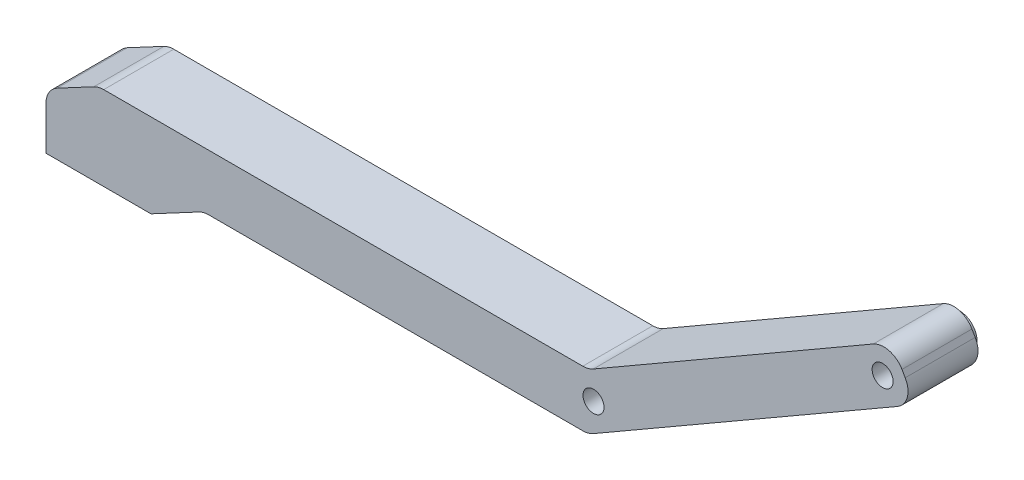
ISO-10303-21;
HEADER;
FILE_DESCRIPTION(('STEP AP214'),'2;1');
FILE_NAME('part.step','',(''),(''),'','','');
FILE_SCHEMA(('AUTOMOTIVE_DESIGN { 1 0 10303 214 1 1 1 1 }'));
ENDSEC;
DATA;
#1=APPLICATION_CONTEXT('core data for automotive mechanical design processes');
#2=APPLICATION_PROTOCOL_DEFINITION('international standard','automotive_design',2000,#1);
#3=PRODUCT_CONTEXT('',#1,'mechanical');
#4=PRODUCT('Part','Part','',(#3));
#5=PRODUCT_RELATED_PRODUCT_CATEGORY('part','',(#4));
#6=PRODUCT_DEFINITION_FORMATION('','',#4);
#7=PRODUCT_DEFINITION_CONTEXT('part definition',#1,'design');
#8=PRODUCT_DEFINITION('design','',#6,#7);
#9=PRODUCT_DEFINITION_SHAPE('','',#8);
#10=(LENGTH_UNIT() NAMED_UNIT(*) SI_UNIT(.MILLI.,.METRE.));
#11=(NAMED_UNIT(*) PLANE_ANGLE_UNIT() SI_UNIT($,.RADIAN.));
#12=(NAMED_UNIT(*) SI_UNIT($,.STERADIAN.) SOLID_ANGLE_UNIT());
#13=UNCERTAINTY_MEASURE_WITH_UNIT(LENGTH_MEASURE(1.E-05),#10,'distance_accuracy_value','');
#14=(GEOMETRIC_REPRESENTATION_CONTEXT(3) GLOBAL_UNCERTAINTY_ASSIGNED_CONTEXT((#13)) GLOBAL_UNIT_ASSIGNED_CONTEXT((#10,
#11,#12)) REPRESENTATION_CONTEXT('',''));
#15=CARTESIAN_POINT('',(0.,0.,0.));
#16=DIRECTION('',(0.,0.,1.));
#17=DIRECTION('',(1.,0.,0.));
#18=AXIS2_PLACEMENT_3D('',#15,#16,#17);
#19=CARTESIAN_POINT('',(0.,0.,10.));
#20=DIRECTION('',(0.,0.,1.));
#21=DIRECTION('',(1.,0.,0.));
#22=AXIS2_PLACEMENT_3D('',#19,#20,#21);
#23=PLANE('',#22);
#24=DIRECTION('',(-0.500000000000005,0.866025403784436,0.));
#25=VECTOR('',#24,1.);
#26=CARTESIAN_POINT('',(116.76537180436,27.,10.));
#27=LINE('',#26,#25);
#28=CARTESIAN_POINT('',(115.26537180436,29.5980762113533,10.));
#29=VERTEX_POINT('',#28);
#30=CARTESIAN_POINT('',(114.801270189222,30.4019237886467,10.));
#31=VERTEX_POINT('',#30);
#32=EDGE_CURVE('E335',#29,#31,#27,.T.);
#33=ORIENTED_EDGE('',*,*,#32,.T.);
#34=CARTESIAN_POINT('',(112.203193977869,28.9019237886467,10.));
#35=DIRECTION('',(0.,0.,1.));
#36=DIRECTION('',(1.,0.,0.));
#37=AXIS2_PLACEMENT_3D('',#34,#35,#36);
#38=CIRCLE('',#37,3.);
#39=CARTESIAN_POINT('',(110.703193977869,31.5,10.));
#40=VERTEX_POINT('',#39);
#41=EDGE_CURVE('E275',#31,#40,#38,.T.);
#42=ORIENTED_EDGE('',*,*,#41,.T.);
#43=DIRECTION('',(-0.866025403784439,-0.5,0.));
#44=VECTOR('',#43,1.);
#45=CARTESIAN_POINT('',(70.,8.,10.));
#46=LINE('',#45,#44);
#47=CARTESIAN_POINT('',(70.6961524227066,8.40192378864668,10.));
#48=VERTEX_POINT('',#47);
#49=EDGE_CURVE('E327',#40,#48,#46,.T.);
#50=ORIENTED_EDGE('',*,*,#49,.T.);
#51=CARTESIAN_POINT('',(69.1961524227066,11.,10.));
#52=DIRECTION('',(0.,0.,1.));
#53=DIRECTION('',(1.,0.,0.));
#54=AXIS2_PLACEMENT_3D('',#51,#52,#53);
#55=CIRCLE('',#54,3.);
#56=CARTESIAN_POINT('',(69.1961524227066,8.,10.));
#57=VERTEX_POINT('',#56);
#58=EDGE_CURVE('E11',#48,#57,#55,.F.);
#59=ORIENTED_EDGE('',*,*,#58,.T.);
#60=DIRECTION('',(-1.,0.,0.));
#61=VECTOR('',#60,1.);
#62=CARTESIAN_POINT('',(0.,8.,10.));
#63=LINE('',#62,#61);
#64=CARTESIAN_POINT('',(0.749999999999999,8.,10.));
#65=VERTEX_POINT('',#64);
#66=EDGE_CURVE('E325',#57,#65,#63,.T.);
#67=ORIENTED_EDGE('',*,*,#66,.T.);
#68=CARTESIAN_POINT('',(0.749999999999999,5.,10.));
#69=DIRECTION('',(0.,0.,1.));
#70=DIRECTION('',(1.,0.,0.));
#71=AXIS2_PLACEMENT_3D('',#68,#69,#70);
#72=CIRCLE('',#71,3.);
#73=CARTESIAN_POINT('',(-0.661764705882355,7.64705882352941,10.));
#74=VERTEX_POINT('',#73);
#75=EDGE_CURVE('E266',#65,#74,#72,.T.);
#76=ORIENTED_EDGE('',*,*,#75,.T.);
#77=DIRECTION('',(-0.882352941176471,-0.470588235294118,0.));
#78=VECTOR('',#77,1.);
#79=CARTESIAN_POINT('',(0.,8.,10.));
#80=LINE('',#79,#78);
#81=CARTESIAN_POINT('',(-5.91176470588236,4.84705882352941,10.));
#82=VERTEX_POINT('',#81);
#83=EDGE_CURVE('E170',#74,#82,#80,.T.);
#84=ORIENTED_EDGE('',*,*,#83,.T.);
#85=CARTESIAN_POINT('',(-4.5,2.2,10.));
#86=DIRECTION('',(0.,0.,1.));
#87=DIRECTION('',(1.,0.,0.));
#88=AXIS2_PLACEMENT_3D('',#85,#86,#87);
#89=CIRCLE('',#88,3.);
#90=CARTESIAN_POINT('',(-7.5,2.2,10.));
#91=VERTEX_POINT('',#90);
#92=EDGE_CURVE('E62',#82,#91,#89,.T.);
#93=ORIENTED_EDGE('',*,*,#92,.T.);
#94=DIRECTION('',(0.,-1.,0.));
#95=VECTOR('',#94,1.);
#96=CARTESIAN_POINT('',(-7.5,4.,10.));
#97=LINE('',#96,#95);
#98=CARTESIAN_POINT('',(-7.5,-4.,10.));
#99=VERTEX_POINT('',#98);
#100=EDGE_CURVE('E158',#91,#99,#97,.T.);
#101=ORIENTED_EDGE('',*,*,#100,.T.);
#102=DIRECTION('',(1.,0.,0.));
#103=VECTOR('',#102,1.);
#104=CARTESIAN_POINT('',(-7.5,-4.,10.));
#105=LINE('',#104,#103);
#106=CARTESIAN_POINT('',(7.5,-4.,10.));
#107=VERTEX_POINT('',#106);
#108=EDGE_CURVE('E164',#99,#107,#105,.T.);
#109=ORIENTED_EDGE('',*,*,#108,.T.);
#110=DIRECTION('',(0.882352941176471,0.470588235294118,0.));
#111=VECTOR('',#110,1.);
#112=CARTESIAN_POINT('',(7.5,-4.,10.));
#113=LINE('',#112,#111);
#114=CARTESIAN_POINT('',(14.3382352941176,-0.352941176470585,10.));
#115=VERTEX_POINT('',#114);
#116=EDGE_CURVE('E224',#107,#115,#113,.T.);
#117=ORIENTED_EDGE('',*,*,#116,.T.);
#118=CARTESIAN_POINT('',(15.75,-3.,10.));
#119=DIRECTION('',(0.,0.,1.));
#120=DIRECTION('',(1.,0.,0.));
#121=AXIS2_PLACEMENT_3D('',#118,#119,#120);
#122=CIRCLE('',#121,3.);
#123=CARTESIAN_POINT('',(15.75,0.,10.));
#124=VERTEX_POINT('',#123);
#125=EDGE_CURVE('E304',#115,#124,#122,.F.);
#126=ORIENTED_EDGE('',*,*,#125,.T.);
#127=DIRECTION('',(1.,0.,0.));
#128=VECTOR('',#127,1.);
#129=CARTESIAN_POINT('',(15.,0.,10.));
#130=LINE('',#129,#128);
#131=CARTESIAN_POINT('',(69.1961524227066,0.,10.));
#132=VERTEX_POINT('',#131);
#133=EDGE_CURVE('E344',#124,#132,#130,.T.);
#134=ORIENTED_EDGE('',*,*,#133,.T.);
#135=CARTESIAN_POINT('',(69.1961524227066,3.,10.));
#136=DIRECTION('',(0.,0.,1.));
#137=DIRECTION('',(1.,0.,0.));
#138=AXIS2_PLACEMENT_3D('',#135,#136,#137);
#139=CIRCLE('',#138,3.);
#140=CARTESIAN_POINT('',(70.6961524227066,0.40192378864668,10.));
#141=VERTEX_POINT('',#140);
#142=EDGE_CURVE('E269',#132,#141,#139,.T.);
#143=ORIENTED_EDGE('',*,*,#142,.T.);
#144=DIRECTION('',(0.866025403784439,0.5,0.));
#145=VECTOR('',#144,1.);
#146=CARTESIAN_POINT('',(70.,0.,10.));
#147=LINE('',#146,#145);
#148=CARTESIAN_POINT('',(114.167295593006,25.5,10.));
#149=VERTEX_POINT('',#148);
#150=EDGE_CURVE('E340',#141,#149,#147,.T.);
#151=ORIENTED_EDGE('',*,*,#150,.T.);
#152=CARTESIAN_POINT('',(112.667295593006,28.0980762113533,10.));
#153=DIRECTION('',(0.,0.,1.));
#154=DIRECTION('',(1.,0.,0.));
#155=AXIS2_PLACEMENT_3D('',#152,#153,#154);
#156=CIRCLE('',#155,3.);
#157=EDGE_CURVE('E272',#149,#29,#156,.T.);
#158=ORIENTED_EDGE('',*,*,#157,.T.);
#159=EDGE_LOOP('',(#33,#42,#50,#59,#67,#76,#84,#93,#101,#109,#117,#126,#134,#143,#151,#158));
#160=FACE_BOUND('',#159,.T.);
#161=CARTESIAN_POINT('',(70.727461339179,4.42000000000001,10.));
#162=DIRECTION('',(0.,0.,1.));
#163=DIRECTION('',(1.,0.,0.));
#164=AXIS2_PLACEMENT_3D('',#161,#162,#163);
#165=CIRCLE('',#164,1.5);
#166=CARTESIAN_POINT('',(72.227461339179,4.42000000000001,10.));
#167=VERTEX_POINT('',#166);
#168=EDGE_CURVE('E353',#167,#167,#165,.T.);
#169=ORIENTED_EDGE('',*,*,#168,.F.);
#170=EDGE_LOOP('',(#169));
#171=FACE_BOUND('',#170,.T.);
#172=CARTESIAN_POINT('',(112.036873099697,28.27,10.));
#173=DIRECTION('',(0.,0.,1.));
#174=DIRECTION('',(1.,0.,0.));
#175=AXIS2_PLACEMENT_3D('',#172,#173,#174);
#176=CIRCLE('',#175,1.5);
#177=CARTESIAN_POINT('',(113.536873099697,28.27,10.));
#178=VERTEX_POINT('',#177);
#179=EDGE_CURVE('E197',#178,#178,#176,.T.);
#180=ORIENTED_EDGE('',*,*,#179,.F.);
#181=EDGE_LOOP('',(#180));
#182=FACE_BOUND('',#181,.T.);
#183=ADVANCED_FACE('F45',(#160,#171,#182),#23,.T.);
#184=CARTESIAN_POINT('',(0.,0.,0.));
#185=DIRECTION('',(0.,0.,1.));
#186=DIRECTION('',(1.,0.,0.));
#187=AXIS2_PLACEMENT_3D('',#184,#185,#186);
#188=PLANE('',#187);
#189=CARTESIAN_POINT('',(112.036873099697,28.27,0.));
#190=DIRECTION('',(0.,0.,1.));
#191=DIRECTION('',(1.,0.,0.));
#192=AXIS2_PLACEMENT_3D('',#189,#190,#191);
#193=CIRCLE('',#192,2.5);
#194=CARTESIAN_POINT('',(114.536873099697,28.27,0.));
#195=VERTEX_POINT('',#194);
#196=EDGE_CURVE('E49',#195,#195,#193,.T.);
#197=ORIENTED_EDGE('',*,*,#196,.T.);
#198=EDGE_LOOP('',(#197));
#199=FACE_BOUND('',#198,.T.);
#200=DIRECTION('',(-0.866025403784439,-0.5,0.));
#201=VECTOR('',#200,1.);
#202=CARTESIAN_POINT('',(70.,8.,0.));
#203=LINE('',#202,#201);
#204=CARTESIAN_POINT('',(110.703193977869,31.5,0.));
#205=VERTEX_POINT('',#204);
#206=CARTESIAN_POINT('',(70.6961524227066,8.40192378864668,0.));
#207=VERTEX_POINT('',#206);
#208=EDGE_CURVE('E209',#205,#207,#203,.T.);
#209=ORIENTED_EDGE('',*,*,#208,.F.);
#210=CARTESIAN_POINT('',(112.203193977869,28.9019237886467,0.));
#211=DIRECTION('',(0.,0.,1.));
#212=DIRECTION('',(1.,0.,0.));
#213=AXIS2_PLACEMENT_3D('',#210,#211,#212);
#214=CIRCLE('',#213,3.);
#215=CARTESIAN_POINT('',(114.801270189222,30.4019237886467,0.));
#216=VERTEX_POINT('',#215);
#217=EDGE_CURVE('E254',#205,#216,#214,.F.);
#218=ORIENTED_EDGE('',*,*,#217,.T.);
#219=DIRECTION('',(-0.500000000000005,0.866025403784436,0.));
#220=VECTOR('',#219,1.);
#221=CARTESIAN_POINT('',(116.76537180436,27.,0.));
#222=LINE('',#221,#220);
#223=CARTESIAN_POINT('',(115.26537180436,29.5980762113533,0.));
#224=VERTEX_POINT('',#223);
#225=EDGE_CURVE('E205',#224,#216,#222,.T.);
#226=ORIENTED_EDGE('',*,*,#225,.F.);
#227=CARTESIAN_POINT('',(112.667295593006,28.0980762113533,0.));
#228=DIRECTION('',(0.,0.,1.));
#229=DIRECTION('',(1.,0.,0.));
#230=AXIS2_PLACEMENT_3D('',#227,#228,#229);
#231=CIRCLE('',#230,3.);
#232=CARTESIAN_POINT('',(114.167295593006,25.5,0.));
#233=VERTEX_POINT('',#232);
#234=EDGE_CURVE('E251',#224,#233,#231,.F.);
#235=ORIENTED_EDGE('',*,*,#234,.T.);
#236=DIRECTION('',(0.866025403784439,0.5,0.));
#237=VECTOR('',#236,1.);
#238=CARTESIAN_POINT('',(70.,0.,0.));
#239=LINE('',#238,#237);
#240=CARTESIAN_POINT('',(70.6961524227066,0.40192378864668,0.));
#241=VERTEX_POINT('',#240);
#242=EDGE_CURVE('E201',#241,#233,#239,.T.);
#243=ORIENTED_EDGE('',*,*,#242,.F.);
#244=CARTESIAN_POINT('',(69.1961524227066,3.,0.));
#245=DIRECTION('',(0.,0.,1.));
#246=DIRECTION('',(1.,0.,0.));
#247=AXIS2_PLACEMENT_3D('',#244,#245,#246);
#248=CIRCLE('',#247,3.);
#249=CARTESIAN_POINT('',(69.1961524227066,0.,0.));
#250=VERTEX_POINT('',#249);
#251=EDGE_CURVE('E248',#241,#250,#248,.F.);
#252=ORIENTED_EDGE('',*,*,#251,.T.);
#253=DIRECTION('',(1.,0.,0.));
#254=VECTOR('',#253,1.);
#255=CARTESIAN_POINT('',(15.,0.,0.));
#256=LINE('',#255,#254);
#257=CARTESIAN_POINT('',(15.75,0.,0.));
#258=VERTEX_POINT('',#257);
#259=EDGE_CURVE('E196',#258,#250,#256,.T.);
#260=ORIENTED_EDGE('',*,*,#259,.F.);
#261=CARTESIAN_POINT('',(15.75,-3.,0.));
#262=DIRECTION('',(0.,0.,1.));
#263=DIRECTION('',(1.,0.,0.));
#264=AXIS2_PLACEMENT_3D('',#261,#262,#263);
#265=CIRCLE('',#264,3.);
#266=CARTESIAN_POINT('',(14.3382352941176,-0.352941176470585,0.));
#267=VERTEX_POINT('',#266);
#268=EDGE_CURVE('E301',#258,#267,#265,.T.);
#269=ORIENTED_EDGE('',*,*,#268,.T.);
#270=DIRECTION('',(0.882352941176471,0.470588235294118,0.));
#271=VECTOR('',#270,1.);
#272=CARTESIAN_POINT('',(7.5,-4.,0.));
#273=LINE('',#272,#271);
#274=CARTESIAN_POINT('',(7.5,-4.,0.));
#275=VERTEX_POINT('',#274);
#276=EDGE_CURVE('E192',#275,#267,#273,.T.);
#277=ORIENTED_EDGE('',*,*,#276,.F.);
#278=DIRECTION('',(1.,0.,0.));
#279=VECTOR('',#278,1.);
#280=CARTESIAN_POINT('',(-7.5,-4.,0.));
#281=LINE('',#280,#279);
#282=CARTESIAN_POINT('',(-7.5,-4.,0.));
#283=VERTEX_POINT('',#282);
#284=EDGE_CURVE('E222',#283,#275,#281,.T.);
#285=ORIENTED_EDGE('',*,*,#284,.F.);
#286=DIRECTION('',(0.,-1.,0.));
#287=VECTOR('',#286,1.);
#288=CARTESIAN_POINT('',(-7.5,4.,0.));
#289=LINE('',#288,#287);
#290=CARTESIAN_POINT('',(-7.5,2.2,0.));
#291=VERTEX_POINT('',#290);
#292=EDGE_CURVE('E176',#291,#283,#289,.T.);
#293=ORIENTED_EDGE('',*,*,#292,.F.);
#294=CARTESIAN_POINT('',(-4.5,2.2,0.));
#295=DIRECTION('',(0.,0.,1.));
#296=DIRECTION('',(1.,0.,0.));
#297=AXIS2_PLACEMENT_3D('',#294,#295,#296);
#298=CIRCLE('',#297,3.);
#299=CARTESIAN_POINT('',(-5.91176470588236,4.84705882352941,0.));
#300=VERTEX_POINT('',#299);
#301=EDGE_CURVE('E242',#291,#300,#298,.F.);
#302=ORIENTED_EDGE('',*,*,#301,.T.);
#303=DIRECTION('',(-0.882352941176471,-0.470588235294118,0.));
#304=VECTOR('',#303,1.);
#305=CARTESIAN_POINT('',(0.,8.,0.));
#306=LINE('',#305,#304);
#307=CARTESIAN_POINT('',(-0.661764705882355,7.64705882352941,0.));
#308=VERTEX_POINT('',#307);
#309=EDGE_CURVE('E217',#308,#300,#306,.T.);
#310=ORIENTED_EDGE('',*,*,#309,.F.);
#311=CARTESIAN_POINT('',(0.749999999999999,5.,0.));
#312=DIRECTION('',(0.,0.,1.));
#313=DIRECTION('',(1.,0.,0.));
#314=AXIS2_PLACEMENT_3D('',#311,#312,#313);
#315=CIRCLE('',#314,3.);
#316=CARTESIAN_POINT('',(0.749999999999999,8.,0.));
#317=VERTEX_POINT('',#316);
#318=EDGE_CURVE('E245',#308,#317,#315,.F.);
#319=ORIENTED_EDGE('',*,*,#318,.T.);
#320=DIRECTION('',(-1.,0.,0.));
#321=VECTOR('',#320,1.);
#322=CARTESIAN_POINT('',(0.,8.,0.));
#323=LINE('',#322,#321);
#324=CARTESIAN_POINT('',(69.1961524227066,8.,0.));
#325=VERTEX_POINT('',#324);
#326=EDGE_CURVE('E213',#325,#317,#323,.T.);
#327=ORIENTED_EDGE('',*,*,#326,.F.);
#328=CARTESIAN_POINT('',(69.1961524227066,11.,0.));
#329=DIRECTION('',(0.,0.,1.));
#330=DIRECTION('',(1.,0.,0.));
#331=AXIS2_PLACEMENT_3D('',#328,#329,#330);
#332=CIRCLE('',#331,3.);
#333=EDGE_CURVE('E55',#325,#207,#332,.T.);
#334=ORIENTED_EDGE('',*,*,#333,.T.);
#335=EDGE_LOOP('',(#209,#218,#226,#235,#243,#252,#260,#269,#277,#285,#293,#302,#310,#319,#327,#334));
#336=FACE_BOUND('',#335,.T.);
#337=CARTESIAN_POINT('',(70.727461339179,4.42000000000001,0.));
#338=DIRECTION('',(0.,0.,1.));
#339=DIRECTION('',(1.,0.,0.));
#340=AXIS2_PLACEMENT_3D('',#337,#338,#339);
#341=CIRCLE('',#340,1.5);
#342=CARTESIAN_POINT('',(72.227461339179,4.42000000000001,0.));
#343=VERTEX_POINT('',#342);
#344=EDGE_CURVE('E354',#343,#343,#341,.T.);
#345=ORIENTED_EDGE('',*,*,#344,.T.);
#346=EDGE_LOOP('',(#345));
#347=FACE_BOUND('',#346,.T.);
#348=ADVANCED_FACE('F311',(#199,#336,#347),#188,.F.);
#349=CARTESIAN_POINT('',(7.5,-4.,10.));
#350=DIRECTION('',(-0.470588235294118,0.882352941176471,0.));
#351=DIRECTION('',(-0.882352941176471,-0.470588235294118,0.));
#352=AXIS2_PLACEMENT_3D('',#349,#350,#351);
#353=PLANE('',#352);
#354=ORIENTED_EDGE('',*,*,#276,.T.);
#355=DIRECTION('',(0.,0.,-1.));
#356=VECTOR('',#355,1.);
#357=CARTESIAN_POINT('',(14.3382352941176,-0.352941176470585,10.));
#358=LINE('',#357,#356);
#359=EDGE_CURVE('E232',#267,#115,#358,.F.);
#360=ORIENTED_EDGE('',*,*,#359,.T.);
#361=ORIENTED_EDGE('',*,*,#116,.F.);
#362=DIRECTION('',(0.,0.,-1.));
#363=VECTOR('',#362,1.);
#364=CARTESIAN_POINT('',(7.5,-4.,10.));
#365=LINE('',#364,#363);
#366=EDGE_CURVE('E181',#107,#275,#365,.T.);
#367=ORIENTED_EDGE('',*,*,#366,.T.);
#368=EDGE_LOOP('',(#354,#360,#361,#367));
#369=FACE_BOUND('',#368,.T.);
#370=ADVANCED_FACE('F393',(#369),#353,.F.);
#371=CARTESIAN_POINT('',(15.,0.,10.));
#372=DIRECTION('',(0.,1.,0.));
#373=DIRECTION('',(-1.,0.,0.));
#374=AXIS2_PLACEMENT_3D('',#371,#372,#373);
#375=PLANE('',#374);
#376=ORIENTED_EDGE('',*,*,#133,.F.);
#377=DIRECTION('',(0.,0.,-1.));
#378=VECTOR('',#377,1.);
#379=CARTESIAN_POINT('',(15.75,0.,0.));
#380=LINE('',#379,#378);
#381=EDGE_CURVE('E228',#124,#258,#380,.T.);
#382=ORIENTED_EDGE('',*,*,#381,.T.);
#383=ORIENTED_EDGE('',*,*,#259,.T.);
#384=DIRECTION('',(0.,0.,-1.));
#385=VECTOR('',#384,1.);
#386=CARTESIAN_POINT('',(69.1961524227066,0.,10.));
#387=LINE('',#386,#385);
#388=EDGE_CURVE('E180',#250,#132,#387,.F.);
#389=ORIENTED_EDGE('',*,*,#388,.T.);
#390=EDGE_LOOP('',(#376,#382,#383,#389));
#391=FACE_BOUND('',#390,.T.);
#392=ADVANCED_FACE('F413',(#391),#375,.F.);
#393=CARTESIAN_POINT('',(70.,0.,10.));
#394=DIRECTION('',(-0.5,0.866025403784439,0.));
#395=DIRECTION('',(-0.866025403784439,-0.5,0.));
#396=AXIS2_PLACEMENT_3D('',#393,#394,#395);
#397=PLANE('',#396);
#398=ORIENTED_EDGE('',*,*,#242,.T.);
#399=DIRECTION('',(0.,0.,-1.));
#400=VECTOR('',#399,1.);
#401=CARTESIAN_POINT('',(114.167295593006,25.5,10.));
#402=LINE('',#401,#400);
#403=EDGE_CURVE('E282',#233,#149,#402,.F.);
#404=ORIENTED_EDGE('',*,*,#403,.T.);
#405=ORIENTED_EDGE('',*,*,#150,.F.);
#406=DIRECTION('',(0.,0.,-1.));
#407=VECTOR('',#406,1.);
#408=CARTESIAN_POINT('',(70.6961524227066,0.40192378864668,10.));
#409=LINE('',#408,#407);
#410=EDGE_CURVE('E278',#141,#241,#409,.T.);
#411=ORIENTED_EDGE('',*,*,#410,.T.);
#412=EDGE_LOOP('',(#398,#404,#405,#411));
#413=FACE_BOUND('',#412,.T.);
#414=ADVANCED_FACE('F409',(#413),#397,.F.);
#415=CARTESIAN_POINT('',(116.76537180436,27.,10.));
#416=DIRECTION('',(-0.866025403784436,-0.500000000000004,0.));
#417=DIRECTION('',(0.500000000000004,-0.866025403784436,0.));
#418=AXIS2_PLACEMENT_3D('',#415,#416,#417);
#419=PLANE('',#418);
#420=ORIENTED_EDGE('',*,*,#225,.T.);
#421=DIRECTION('',(0.,0.,-1.));
#422=VECTOR('',#421,1.);
#423=CARTESIAN_POINT('',(114.801270189222,30.4019237886467,10.));
#424=LINE('',#423,#422);
#425=EDGE_CURVE('E261',#216,#31,#424,.F.);
#426=ORIENTED_EDGE('',*,*,#425,.T.);
#427=ORIENTED_EDGE('',*,*,#32,.F.);
#428=DIRECTION('',(0.,0.,-1.));
#429=VECTOR('',#428,1.);
#430=CARTESIAN_POINT('',(115.26537180436,29.5980762113533,10.));
#431=LINE('',#430,#429);
#432=EDGE_CURVE('E257',#29,#224,#431,.T.);
#433=ORIENTED_EDGE('',*,*,#432,.T.);
#434=EDGE_LOOP('',(#420,#426,#427,#433));
#435=FACE_BOUND('',#434,.T.);
#436=ADVANCED_FACE('F406',(#435),#419,.F.);
#437=CARTESIAN_POINT('',(70.,8.,10.));
#438=DIRECTION('',(0.5,-0.866025403784439,0.));
#439=DIRECTION('',(0.866025403784439,0.5,0.));
#440=AXIS2_PLACEMENT_3D('',#437,#438,#439);
#441=PLANE('',#440);
#442=ORIENTED_EDGE('',*,*,#49,.F.);
#443=DIRECTION('',(0.,0.,-1.));
#444=VECTOR('',#443,1.);
#445=CARTESIAN_POINT('',(110.703193977869,31.5,10.));
#446=LINE('',#445,#444);
#447=EDGE_CURVE('E238',#40,#205,#446,.T.);
#448=ORIENTED_EDGE('',*,*,#447,.T.);
#449=ORIENTED_EDGE('',*,*,#208,.T.);
#450=DIRECTION('',(0.,0.,-1.));
#451=VECTOR('',#450,1.);
#452=CARTESIAN_POINT('',(70.6961524227066,8.40192378864668,10.));
#453=LINE('',#452,#451);
#454=EDGE_CURVE('E235',#207,#48,#453,.F.);
#455=ORIENTED_EDGE('',*,*,#454,.T.);
#456=EDGE_LOOP('',(#442,#448,#449,#455));
#457=FACE_BOUND('',#456,.T.);
#458=ADVANCED_FACE('F318',(#457),#441,.F.);
#459=CARTESIAN_POINT('',(0.,8.,10.));
#460=DIRECTION('',(0.,-1.,0.));
#461=DIRECTION('',(0.,0.,-1.));
#462=AXIS2_PLACEMENT_3D('',#459,#460,#461);
#463=PLANE('',#462);
#464=ORIENTED_EDGE('',*,*,#66,.F.);
#465=DIRECTION('',(0.,0.,-1.));
#466=VECTOR('',#465,1.);
#467=CARTESIAN_POINT('',(69.1961524227066,8.,0.));
#468=LINE('',#467,#466);
#469=EDGE_CURVE('E288',#57,#325,#468,.T.);
#470=ORIENTED_EDGE('',*,*,#469,.T.);
#471=ORIENTED_EDGE('',*,*,#326,.T.);
#472=DIRECTION('',(0.,0.,-1.));
#473=VECTOR('',#472,1.);
#474=CARTESIAN_POINT('',(0.749999999999999,8.,10.));
#475=LINE('',#474,#473);
#476=EDGE_CURVE('E285',#317,#65,#475,.F.);
#477=ORIENTED_EDGE('',*,*,#476,.T.);
#478=EDGE_LOOP('',(#464,#470,#471,#477));
#479=FACE_BOUND('',#478,.T.);
#480=ADVANCED_FACE('F329',(#479),#463,.F.);
#481=CARTESIAN_POINT('',(0.,8.,10.));
#482=DIRECTION('',(0.470588235294118,-0.882352941176471,0.));
#483=DIRECTION('',(0.882352941176471,0.470588235294118,0.));
#484=AXIS2_PLACEMENT_3D('',#481,#482,#483);
#485=PLANE('',#484);
#486=ORIENTED_EDGE('',*,*,#83,.F.);
#487=DIRECTION('',(0.,0.,-1.));
#488=VECTOR('',#487,1.);
#489=CARTESIAN_POINT('',(-0.661764705882354,7.64705882352941,10.));
#490=LINE('',#489,#488);
#491=EDGE_CURVE('E294',#74,#308,#490,.T.);
#492=ORIENTED_EDGE('',*,*,#491,.T.);
#493=ORIENTED_EDGE('',*,*,#309,.T.);
#494=DIRECTION('',(0.,0.,-1.));
#495=VECTOR('',#494,1.);
#496=CARTESIAN_POINT('',(-5.91176470588236,4.84705882352941,10.));
#497=LINE('',#496,#495);
#498=EDGE_CURVE('E70',#300,#82,#497,.F.);
#499=ORIENTED_EDGE('',*,*,#498,.T.);
#500=EDGE_LOOP('',(#486,#492,#493,#499));
#501=FACE_BOUND('',#500,.T.);
#502=ADVANCED_FACE('F399',(#501),#485,.F.);
#503=CARTESIAN_POINT('',(-7.5,4.,10.));
#504=DIRECTION('',(1.,0.,0.));
#505=DIRECTION('',(0.,0.,-1.));
#506=AXIS2_PLACEMENT_3D('',#503,#504,#505);
#507=PLANE('',#506);
#508=ORIENTED_EDGE('',*,*,#100,.F.);
#509=DIRECTION('',(0.,0.,-1.));
#510=VECTOR('',#509,1.);
#511=CARTESIAN_POINT('',(-7.5,2.2,10.));
#512=LINE('',#511,#510);
#513=EDGE_CURVE('E298',#91,#291,#512,.T.);
#514=ORIENTED_EDGE('',*,*,#513,.T.);
#515=ORIENTED_EDGE('',*,*,#292,.T.);
#516=DIRECTION('',(0.,0.,-1.));
#517=VECTOR('',#516,1.);
#518=CARTESIAN_POINT('',(-7.5,-4.,10.));
#519=LINE('',#518,#517);
#520=EDGE_CURVE('E173',#99,#283,#519,.T.);
#521=ORIENTED_EDGE('',*,*,#520,.F.);
#522=EDGE_LOOP('',(#508,#514,#515,#521));
#523=FACE_BOUND('',#522,.T.);
#524=ADVANCED_FACE('F174',(#523),#507,.F.);
#525=CARTESIAN_POINT('',(-7.5,-4.,10.));
#526=DIRECTION('',(0.,1.,0.));
#527=DIRECTION('',(0.,0.,1.));
#528=AXIS2_PLACEMENT_3D('',#525,#526,#527);
#529=PLANE('',#528);
#530=ORIENTED_EDGE('',*,*,#284,.T.);
#531=ORIENTED_EDGE('',*,*,#366,.F.);
#532=ORIENTED_EDGE('',*,*,#108,.F.);
#533=ORIENTED_EDGE('',*,*,#520,.T.);
#534=EDGE_LOOP('',(#530,#531,#532,#533));
#535=FACE_BOUND('',#534,.T.);
#536=ADVANCED_FACE('F183',(#535),#529,.F.);
#537=CARTESIAN_POINT('',(112.036873099697,28.27,10.));
#538=DIRECTION('',(0.,0.,-1.));
#539=DIRECTION('',(-1.,0.,0.));
#540=AXIS2_PLACEMENT_3D('',#537,#538,#539);
#541=CYLINDRICAL_SURFACE('',#540,1.5);
#542=ORIENTED_EDGE('',*,*,#179,.T.);
#543=EDGE_LOOP('',(#542));
#544=FACE_BOUND('',#543,.T.);
#545=CARTESIAN_POINT('',(112.036873099697,28.27,-0.999999999999999));
#546=DIRECTION('',(0.,0.,1.));
#547=DIRECTION('',(1.,0.,0.));
#548=AXIS2_PLACEMENT_3D('',#545,#546,#547);
#549=CIRCLE('',#548,1.5);
#550=CARTESIAN_POINT('',(113.536873099697,28.27,-0.999999999999999));
#551=VERTEX_POINT('',#550);
#552=EDGE_CURVE('E365',#551,#551,#549,.T.);
#553=ORIENTED_EDGE('',*,*,#552,.F.);
#554=EDGE_LOOP('',(#553));
#555=FACE_BOUND('',#554,.T.);
#556=ADVANCED_FACE('F373',(#544,#555),#541,.F.);
#557=CARTESIAN_POINT('',(70.727461339179,4.42000000000001,10.));
#558=DIRECTION('',(0.,0.,-1.));
#559=DIRECTION('',(-1.,0.,0.));
#560=AXIS2_PLACEMENT_3D('',#557,#558,#559);
#561=CYLINDRICAL_SURFACE('',#560,1.5);
#562=ORIENTED_EDGE('',*,*,#168,.T.);
#563=EDGE_LOOP('',(#562));
#564=FACE_BOUND('',#563,.T.);
#565=ORIENTED_EDGE('',*,*,#344,.F.);
#566=EDGE_LOOP('',(#565));
#567=FACE_BOUND('',#566,.T.);
#568=ADVANCED_FACE('F375',(#564,#567),#561,.F.);
#569=CARTESIAN_POINT('',(15.75,-3.,10.));
#570=DIRECTION('',(0.,0.,1.));
#571=DIRECTION('',(1.,0.,0.));
#572=AXIS2_PLACEMENT_3D('',#569,#570,#571);
#573=CYLINDRICAL_SURFACE('',#572,3.);
#574=ORIENTED_EDGE('',*,*,#125,.F.);
#575=ORIENTED_EDGE('',*,*,#359,.F.);
#576=ORIENTED_EDGE('',*,*,#268,.F.);
#577=ORIENTED_EDGE('',*,*,#381,.F.);
#578=EDGE_LOOP('',(#574,#575,#576,#577));
#579=FACE_BOUND('',#578,.T.);
#580=ADVANCED_FACE('F383',(#579),#573,.F.);
#581=CARTESIAN_POINT('',(112.203193977869,28.9019237886467,10.));
#582=DIRECTION('',(0.,0.,-1.));
#583=DIRECTION('',(-1.,0.,0.));
#584=AXIS2_PLACEMENT_3D('',#581,#582,#583);
#585=CYLINDRICAL_SURFACE('',#584,3.);
#586=ORIENTED_EDGE('',*,*,#41,.F.);
#587=ORIENTED_EDGE('',*,*,#425,.F.);
#588=ORIENTED_EDGE('',*,*,#217,.F.);
#589=ORIENTED_EDGE('',*,*,#447,.F.);
#590=EDGE_LOOP('',(#586,#587,#588,#589));
#591=FACE_BOUND('',#590,.T.);
#592=ADVANCED_FACE('F423',(#591),#585,.T.);
#593=CARTESIAN_POINT('',(112.667295593006,28.0980762113533,10.));
#594=DIRECTION('',(0.,0.,-1.));
#595=DIRECTION('',(-1.,0.,0.));
#596=AXIS2_PLACEMENT_3D('',#593,#594,#595);
#597=CYLINDRICAL_SURFACE('',#596,3.);
#598=ORIENTED_EDGE('',*,*,#157,.F.);
#599=ORIENTED_EDGE('',*,*,#403,.F.);
#600=ORIENTED_EDGE('',*,*,#234,.F.);
#601=ORIENTED_EDGE('',*,*,#432,.F.);
#602=EDGE_LOOP('',(#598,#599,#600,#601));
#603=FACE_BOUND('',#602,.T.);
#604=ADVANCED_FACE('F427',(#603),#597,.T.);
#605=CARTESIAN_POINT('',(69.1961524227066,3.,10.));
#606=DIRECTION('',(0.,0.,-1.));
#607=DIRECTION('',(-1.,0.,0.));
#608=AXIS2_PLACEMENT_3D('',#605,#606,#607);
#609=CYLINDRICAL_SURFACE('',#608,3.);
#610=ORIENTED_EDGE('',*,*,#142,.F.);
#611=ORIENTED_EDGE('',*,*,#388,.F.);
#612=ORIENTED_EDGE('',*,*,#251,.F.);
#613=ORIENTED_EDGE('',*,*,#410,.F.);
#614=EDGE_LOOP('',(#610,#611,#612,#613));
#615=FACE_BOUND('',#614,.T.);
#616=ADVANCED_FACE('F431',(#615),#609,.T.);
#617=CARTESIAN_POINT('',(69.1961524227066,11.,10.));
#618=DIRECTION('',(0.,0.,1.));
#619=DIRECTION('',(1.,0.,0.));
#620=AXIS2_PLACEMENT_3D('',#617,#618,#619);
#621=CYLINDRICAL_SURFACE('',#620,3.);
#622=ORIENTED_EDGE('',*,*,#58,.F.);
#623=ORIENTED_EDGE('',*,*,#454,.F.);
#624=ORIENTED_EDGE('',*,*,#333,.F.);
#625=ORIENTED_EDGE('',*,*,#469,.F.);
#626=EDGE_LOOP('',(#622,#623,#624,#625));
#627=FACE_BOUND('',#626,.T.);
#628=ADVANCED_FACE('F322',(#627),#621,.F.);
#629=CARTESIAN_POINT('',(0.749999999999999,5.,10.));
#630=DIRECTION('',(0.,0.,-1.));
#631=DIRECTION('',(-1.,0.,0.));
#632=AXIS2_PLACEMENT_3D('',#629,#630,#631);
#633=CYLINDRICAL_SURFACE('',#632,3.);
#634=ORIENTED_EDGE('',*,*,#75,.F.);
#635=ORIENTED_EDGE('',*,*,#476,.F.);
#636=ORIENTED_EDGE('',*,*,#318,.F.);
#637=ORIENTED_EDGE('',*,*,#491,.F.);
#638=EDGE_LOOP('',(#634,#635,#636,#637));
#639=FACE_BOUND('',#638,.T.);
#640=ADVANCED_FACE('F437',(#639),#633,.T.);
#641=CARTESIAN_POINT('',(-4.5,2.2,10.));
#642=DIRECTION('',(0.,0.,-1.));
#643=DIRECTION('',(-1.,0.,0.));
#644=AXIS2_PLACEMENT_3D('',#641,#642,#643);
#645=CYLINDRICAL_SURFACE('',#644,3.);
#646=ORIENTED_EDGE('',*,*,#92,.F.);
#647=ORIENTED_EDGE('',*,*,#498,.F.);
#648=ORIENTED_EDGE('',*,*,#301,.F.);
#649=ORIENTED_EDGE('',*,*,#513,.F.);
#650=EDGE_LOOP('',(#646,#647,#648,#649));
#651=FACE_BOUND('',#650,.T.);
#652=ADVANCED_FACE('F47',(#651),#645,.T.);
#653=CARTESIAN_POINT('',(112.036873099697,28.27,-0.999999999999999));
#654=DIRECTION('',(0.,0.,1.));
#655=DIRECTION('',(1.,0.,0.));
#656=AXIS2_PLACEMENT_3D('',#653,#654,#655);
#657=CYLINDRICAL_SURFACE('',#656,2.5);
#658=CARTESIAN_POINT('',(112.036873099697,28.27,-0.999999999999999));
#659=DIRECTION('',(0.,0.,1.));
#660=DIRECTION('',(1.,0.,0.));
#661=AXIS2_PLACEMENT_3D('',#658,#659,#660);
#662=CIRCLE('',#661,2.5);
#663=CARTESIAN_POINT('',(114.536873099697,28.27,-0.999999999999999));
#664=VERTEX_POINT('',#663);
#665=EDGE_CURVE('E361',#664,#664,#662,.T.);
#666=ORIENTED_EDGE('',*,*,#665,.T.);
#667=EDGE_LOOP('',(#666));
#668=FACE_BOUND('',#667,.T.);
#669=ORIENTED_EDGE('',*,*,#196,.F.);
#670=EDGE_LOOP('',(#669));
#671=FACE_BOUND('',#670,.T.);
#672=ADVANCED_FACE('F442',(#668,#671),#657,.T.);
#673=CARTESIAN_POINT('',(112.036873099697,28.27,-0.999999999999999));
#674=DIRECTION('',(0.,0.,1.));
#675=DIRECTION('',(1.,0.,0.));
#676=AXIS2_PLACEMENT_3D('',#673,#674,#675);
#677=PLANE('',#676);
#678=ORIENTED_EDGE('',*,*,#552,.T.);
#679=EDGE_LOOP('',(#678));
#680=FACE_BOUND('',#679,.T.);
#681=ORIENTED_EDGE('',*,*,#665,.F.);
#682=EDGE_LOOP('',(#681));
#683=FACE_BOUND('',#682,.T.);
#684=ADVANCED_FACE('F370',(#680,#683),#677,.F.);
#685=CLOSED_SHELL('',(#183,#348,#370,#392,#414,#436,#458,#480,#502,#524,#536,#556,#568,#580,
#592,#604,#616,#628,#640,#652,#672,#684));
#686=MANIFOLD_SOLID_BREP('B2',#685);
#687=ADVANCED_BREP_SHAPE_REPRESENTATION('',(#18,#686),#14);
#688=SHAPE_DEFINITION_REPRESENTATION(#9,#687);
ENDSEC;
END-ISO-10303-21;
